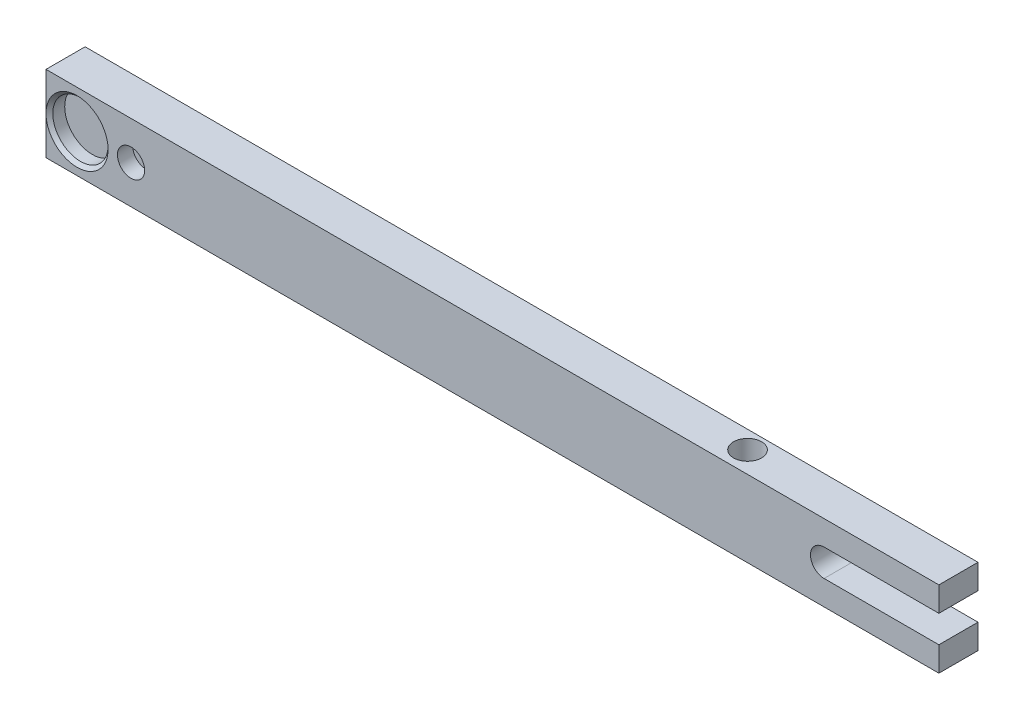
ISO-10303-21;
HEADER;
FILE_DESCRIPTION(('STEP AP214'),'2;1');
FILE_NAME('part.step','',(''),(''),'','','');
FILE_SCHEMA(('AUTOMOTIVE_DESIGN { 1 0 10303 214 1 1 1 1 }'));
ENDSEC;
DATA;
#1=APPLICATION_CONTEXT('core data for automotive mechanical design processes');
#2=APPLICATION_PROTOCOL_DEFINITION('international standard','automotive_design',2000,#1);
#3=PRODUCT_CONTEXT('',#1,'mechanical');
#4=PRODUCT('Part','Part','',(#3));
#5=PRODUCT_RELATED_PRODUCT_CATEGORY('part','',(#4));
#6=PRODUCT_DEFINITION_FORMATION('','',#4);
#7=PRODUCT_DEFINITION_CONTEXT('part definition',#1,'design');
#8=PRODUCT_DEFINITION('design','',#6,#7);
#9=PRODUCT_DEFINITION_SHAPE('','',#8);
#10=(LENGTH_UNIT() NAMED_UNIT(*) SI_UNIT(.MILLI.,.METRE.));
#11=(NAMED_UNIT(*) PLANE_ANGLE_UNIT() SI_UNIT($,.RADIAN.));
#12=(NAMED_UNIT(*) SI_UNIT($,.STERADIAN.) SOLID_ANGLE_UNIT());
#13=UNCERTAINTY_MEASURE_WITH_UNIT(LENGTH_MEASURE(1.E-05),#10,'distance_accuracy_value','');
#14=(GEOMETRIC_REPRESENTATION_CONTEXT(3) GLOBAL_UNCERTAINTY_ASSIGNED_CONTEXT((#13)) GLOBAL_UNIT_ASSIGNED_CONTEXT((#10,
#11,#12)) REPRESENTATION_CONTEXT('',''));
#15=CARTESIAN_POINT('',(0.,0.,0.));
#16=DIRECTION('',(0.,0.,1.));
#17=DIRECTION('',(1.,0.,0.));
#18=AXIS2_PLACEMENT_3D('',#15,#16,#17);
#19=CARTESIAN_POINT('',(52.5,-4.49999999999999,5.));
#20=DIRECTION('',(-1.,0.,0.));
#21=DIRECTION('',(0.,0.,1.));
#22=AXIS2_PLACEMENT_3D('',#19,#20,#21);
#23=PLANE('',#22);
#24=DIRECTION('',(0.,0.,1.));
#25=VECTOR('',#24,1.);
#26=CARTESIAN_POINT('',(52.5,1.6,-5.));
#27=LINE('',#26,#25);
#28=CARTESIAN_POINT('',(52.5,1.6,0.399999999999998));
#29=VERTEX_POINT('',#28);
#30=CARTESIAN_POINT('',(52.5,1.6,5.));
#31=VERTEX_POINT('',#30);
#32=EDGE_CURVE('E144',#29,#31,#27,.T.);
#33=ORIENTED_EDGE('',*,*,#32,.F.);
#34=DIRECTION('',(0.,1.,0.));
#35=VECTOR('',#34,1.);
#36=CARTESIAN_POINT('',(52.5,-4.49999999999999,0.399999999999998));
#37=LINE('',#36,#35);
#38=CARTESIAN_POINT('',(52.5,4.50000000000001,0.399999999999998));
#39=VERTEX_POINT('',#38);
#40=EDGE_CURVE('E11',#29,#39,#37,.T.);
#41=ORIENTED_EDGE('',*,*,#40,.T.);
#42=DIRECTION('',(0.,0.,-1.));
#43=VECTOR('',#42,1.);
#44=CARTESIAN_POINT('',(52.5,4.50000000000001,5.));
#45=LINE('',#44,#43);
#46=CARTESIAN_POINT('',(52.5,4.50000000000001,5.));
#47=VERTEX_POINT('',#46);
#48=EDGE_CURVE('E177',#47,#39,#45,.T.);
#49=ORIENTED_EDGE('',*,*,#48,.F.);
#50=DIRECTION('',(0.,1.,0.));
#51=VECTOR('',#50,1.);
#52=CARTESIAN_POINT('',(52.5,-4.49999999999999,5.));
#53=LINE('',#52,#51);
#54=EDGE_CURVE('E165',#31,#47,#53,.T.);
#55=ORIENTED_EDGE('',*,*,#54,.F.);
#56=EDGE_LOOP('',(#33,#41,#49,#55));
#57=FACE_BOUND('',#56,.T.);
#58=ADVANCED_FACE('F39',(#57),#23,.F.);
#59=CARTESIAN_POINT('',(-52.5,-4.50000000000001,5.));
#60=DIRECTION('',(1.,0.,0.));
#61=DIRECTION('',(0.,0.,-1.));
#62=AXIS2_PLACEMENT_3D('',#59,#60,#61);
#63=PLANE('',#62);
#64=DIRECTION('',(0.,0.,-1.));
#65=VECTOR('',#64,1.);
#66=CARTESIAN_POINT('',(-52.5,4.49999999999999,5.));
#67=LINE('',#66,#65);
#68=CARTESIAN_POINT('',(-52.5,4.49999999999999,5.));
#69=VERTEX_POINT('',#68);
#70=CARTESIAN_POINT('',(-52.5,4.49999999999999,0.399999999999998));
#71=VERTEX_POINT('',#70);
#72=EDGE_CURVE('E169',#69,#71,#67,.T.);
#73=ORIENTED_EDGE('',*,*,#72,.T.);
#74=DIRECTION('',(0.,-1.,0.));
#75=VECTOR('',#74,1.);
#76=CARTESIAN_POINT('',(-52.5,-4.50000000000001,0.399999999999998));
#77=LINE('',#76,#75);
#78=CARTESIAN_POINT('',(-52.5,-4.50000000000001,0.399999999999998));
#79=VERTEX_POINT('',#78);
#80=EDGE_CURVE('E225',#71,#79,#77,.T.);
#81=ORIENTED_EDGE('',*,*,#80,.T.);
#82=DIRECTION('',(0.,0.,-1.));
#83=VECTOR('',#82,1.);
#84=CARTESIAN_POINT('',(-52.5,-4.50000000000001,5.));
#85=LINE('',#84,#83);
#86=CARTESIAN_POINT('',(-52.5,-4.50000000000001,5.));
#87=VERTEX_POINT('',#86);
#88=EDGE_CURVE('E184',#87,#79,#85,.T.);
#89=ORIENTED_EDGE('',*,*,#88,.F.);
#90=DIRECTION('',(0.,-1.,0.));
#91=VECTOR('',#90,1.);
#92=CARTESIAN_POINT('',(-52.5,-4.50000000000001,5.));
#93=LINE('',#92,#91);
#94=CARTESIAN_POINT('',(-52.5,0.,5.));
#95=VERTEX_POINT('',#94);
#96=EDGE_CURVE('E294',#95,#87,#93,.T.);
#97=ORIENTED_EDGE('',*,*,#96,.F.);
#98=EDGE_CURVE('E296',#69,#95,#93,.T.);
#99=ORIENTED_EDGE('',*,*,#98,.F.);
#100=EDGE_LOOP('',(#73,#81,#89,#97,#99));
#101=FACE_BOUND('',#100,.T.);
#102=ADVANCED_FACE('F307',(#101),#63,.F.);
#103=CARTESIAN_POINT('',(52.5,-4.49999999999999,5.));
#104=DIRECTION('',(0.,1.,0.));
#105=DIRECTION('',(-1.,0.,0.));
#106=AXIS2_PLACEMENT_3D('',#103,#104,#105);
#107=PLANE('',#106);
#108=CARTESIAN_POINT('',(27.5,-4.5,2.5));
#109=DIRECTION('',(0.,1.,0.));
#110=DIRECTION('',(-1.,0.,0.));
#111=AXIS2_PLACEMENT_3D('',#108,#109,#110);
#112=CIRCLE('',#111,1.65);
#113=CARTESIAN_POINT('',(25.85,-4.5,2.5));
#114=VERTEX_POINT('',#113);
#115=EDGE_CURVE('E244',#114,#114,#112,.T.);
#116=ORIENTED_EDGE('',*,*,#115,.T.);
#117=EDGE_LOOP('',(#116));
#118=FACE_BOUND('',#117,.T.);
#119=ORIENTED_EDGE('',*,*,#88,.T.);
#120=DIRECTION('',(1.,0.,0.));
#121=VECTOR('',#120,1.);
#122=CARTESIAN_POINT('',(52.5,-4.49999999999999,0.399999999999998));
#123=LINE('',#122,#121);
#124=CARTESIAN_POINT('',(52.5,-4.49999999999999,0.399999999999998));
#125=VERTEX_POINT('',#124);
#126=EDGE_CURVE('E228',#79,#125,#123,.T.);
#127=ORIENTED_EDGE('',*,*,#126,.T.);
#128=DIRECTION('',(0.,0.,-1.));
#129=VECTOR('',#128,1.);
#130=CARTESIAN_POINT('',(52.5,-4.49999999999999,5.));
#131=LINE('',#130,#129);
#132=CARTESIAN_POINT('',(52.5,-4.49999999999999,5.));
#133=VERTEX_POINT('',#132);
#134=EDGE_CURVE('E181',#133,#125,#131,.T.);
#135=ORIENTED_EDGE('',*,*,#134,.F.);
#136=DIRECTION('',(1.,0.,0.));
#137=VECTOR('',#136,1.);
#138=CARTESIAN_POINT('',(52.5,-4.49999999999999,5.));
#139=LINE('',#138,#137);
#140=EDGE_CURVE('E161',#87,#133,#139,.T.);
#141=ORIENTED_EDGE('',*,*,#140,.F.);
#142=EDGE_LOOP('',(#119,#127,#135,#141));
#143=FACE_BOUND('',#142,.T.);
#144=ADVANCED_FACE('F305',(#118,#143),#107,.F.);
#145=ORIENTED_EDGE('',*,*,#134,.T.);
#146=DIRECTION('',(0.,1.,0.));
#147=VECTOR('',#146,1.);
#148=CARTESIAN_POINT('',(52.5,-4.49999999999999,0.399999999999998));
#149=LINE('',#148,#147);
#150=CARTESIAN_POINT('',(52.5,-1.6,0.399999999999998));
#151=VERTEX_POINT('',#150);
#152=EDGE_CURVE('E140',#125,#151,#149,.T.);
#153=ORIENTED_EDGE('',*,*,#152,.T.);
#154=DIRECTION('',(0.,0.,1.));
#155=VECTOR('',#154,1.);
#156=CARTESIAN_POINT('',(52.5,-1.6,-5.));
#157=LINE('',#156,#155);
#158=CARTESIAN_POINT('',(52.5,-1.6,5.));
#159=VERTEX_POINT('',#158);
#160=EDGE_CURVE('E133',#151,#159,#157,.T.);
#161=ORIENTED_EDGE('',*,*,#160,.T.);
#162=EDGE_CURVE('E138',#133,#159,#53,.T.);
#163=ORIENTED_EDGE('',*,*,#162,.F.);
#164=EDGE_LOOP('',(#145,#153,#161,#163));
#165=FACE_BOUND('',#164,.T.);
#166=ADVANCED_FACE('F136',(#165),#23,.F.);
#167=CARTESIAN_POINT('',(52.5,4.50000000000001,5.));
#168=DIRECTION('',(0.,-1.,0.));
#169=DIRECTION('',(1.,0.,0.));
#170=AXIS2_PLACEMENT_3D('',#167,#168,#169);
#171=PLANE('',#170);
#172=CARTESIAN_POINT('',(27.5,4.5,2.5));
#173=DIRECTION('',(0.,1.,0.));
#174=DIRECTION('',(-1.,0.,0.));
#175=AXIS2_PLACEMENT_3D('',#172,#173,#174);
#176=CIRCLE('',#175,1.65);
#177=CARTESIAN_POINT('',(25.85,4.5,2.5));
#178=VERTEX_POINT('',#177);
#179=EDGE_CURVE('E592',#178,#178,#176,.T.);
#180=ORIENTED_EDGE('',*,*,#179,.F.);
#181=EDGE_LOOP('',(#180));
#182=FACE_BOUND('',#181,.T.);
#183=ORIENTED_EDGE('',*,*,#48,.T.);
#184=DIRECTION('',(-1.,0.,0.));
#185=VECTOR('',#184,1.);
#186=CARTESIAN_POINT('',(52.5,4.50000000000001,0.399999999999998));
#187=LINE('',#186,#185);
#188=EDGE_CURVE('E196',#39,#71,#187,.T.);
#189=ORIENTED_EDGE('',*,*,#188,.T.);
#190=ORIENTED_EDGE('',*,*,#72,.F.);
#191=DIRECTION('',(-1.,0.,0.));
#192=VECTOR('',#191,1.);
#193=CARTESIAN_POINT('',(52.5,4.50000000000001,5.));
#194=LINE('',#193,#192);
#195=EDGE_CURVE('E164',#47,#69,#194,.T.);
#196=ORIENTED_EDGE('',*,*,#195,.F.);
#197=EDGE_LOOP('',(#183,#189,#190,#196));
#198=FACE_BOUND('',#197,.T.);
#199=ADVANCED_FACE('F317',(#182,#198),#171,.F.);
#200=CARTESIAN_POINT('',(0.,0.,5.));
#201=DIRECTION('',(0.,0.,1.));
#202=DIRECTION('',(1.,0.,0.));
#203=AXIS2_PLACEMENT_3D('',#200,#201,#202);
#204=PLANE('',#203);
#205=CARTESIAN_POINT('',(-42.5,0.,5.));
#206=DIRECTION('',(0.,0.,-1.));
#207=DIRECTION('',(-1.,0.,0.));
#208=AXIS2_PLACEMENT_3D('',#205,#206,#207);
#209=CIRCLE('',#208,1.6);
#210=CARTESIAN_POINT('',(-44.1,0.,5.));
#211=VERTEX_POINT('',#210);
#212=EDGE_CURVE('E269',#211,#211,#209,.T.);
#213=ORIENTED_EDGE('',*,*,#212,.T.);
#214=EDGE_LOOP('',(#213));
#215=FACE_BOUND('',#214,.T.);
#216=ORIENTED_EDGE('',*,*,#98,.T.);
#217=CARTESIAN_POINT('',(-48.85,0.,5.));
#218=DIRECTION('',(0.,0.,1.));
#219=DIRECTION('',(1.,0.,0.));
#220=AXIS2_PLACEMENT_3D('',#217,#218,#219);
#221=CIRCLE('',#220,3.65);
#222=EDGE_CURVE('E188',#95,#95,#221,.F.);
#223=ORIENTED_EDGE('',*,*,#222,.T.);
#224=ORIENTED_EDGE('',*,*,#96,.T.);
#225=ORIENTED_EDGE('',*,*,#140,.T.);
#226=ORIENTED_EDGE('',*,*,#162,.T.);
#227=DIRECTION('',(1.,0.,0.));
#228=VECTOR('',#227,1.);
#229=CARTESIAN_POINT('',(39.,-1.6,5.));
#230=LINE('',#229,#228);
#231=CARTESIAN_POINT('',(39.,-1.6,5.));
#232=VERTEX_POINT('',#231);
#233=EDGE_CURVE('E148',#232,#159,#230,.T.);
#234=ORIENTED_EDGE('',*,*,#233,.F.);
#235=CARTESIAN_POINT('',(39.,0.,5.));
#236=DIRECTION('',(0.,0.,1.));
#237=DIRECTION('',(1.,0.,0.));
#238=AXIS2_PLACEMENT_3D('',#235,#236,#237);
#239=CIRCLE('',#238,1.6);
#240=CARTESIAN_POINT('',(39.,1.6,5.));
#241=VERTEX_POINT('',#240);
#242=EDGE_CURVE('E156',#241,#232,#239,.T.);
#243=ORIENTED_EDGE('',*,*,#242,.F.);
#244=DIRECTION('',(-1.,0.,0.));
#245=VECTOR('',#244,1.);
#246=CARTESIAN_POINT('',(39.,1.6,5.));
#247=LINE('',#246,#245);
#248=EDGE_CURVE('E155',#31,#241,#247,.T.);
#249=ORIENTED_EDGE('',*,*,#248,.F.);
#250=ORIENTED_EDGE('',*,*,#54,.T.);
#251=ORIENTED_EDGE('',*,*,#195,.T.);
#252=EDGE_LOOP('',(#216,#223,#224,#225,#226,#234,#243,#249,#250,#251));
#253=FACE_BOUND('',#252,.T.);
#254=ADVANCED_FACE('F159',(#215,#253),#204,.T.);
#255=CARTESIAN_POINT('',(0.,0.,0.));
#256=DIRECTION('',(0.,0.,1.));
#257=DIRECTION('',(1.,0.,0.));
#258=AXIS2_PLACEMENT_3D('',#255,#256,#257);
#259=PLANE('',#258);
#260=CARTESIAN_POINT('',(-2.49999999999998,0.,0.));
#261=DIRECTION('',(0.,0.,1.));
#262=DIRECTION('',(1.,0.,0.));
#263=AXIS2_PLACEMENT_3D('',#260,#261,#262);
#264=CIRCLE('',#263,1.5);
#265=CARTESIAN_POINT('',(-0.999999999999981,0.,0.));
#266=VERTEX_POINT('',#265);
#267=EDGE_CURVE('E43',#266,#266,#264,.T.);
#268=ORIENTED_EDGE('',*,*,#267,.T.);
#269=EDGE_LOOP('',(#268));
#270=FACE_BOUND('',#269,.T.);
#271=DIRECTION('',(0.,1.,0.));
#272=VECTOR('',#271,1.);
#273=CARTESIAN_POINT('',(-52.1,0.,0.));
#274=LINE('',#273,#272);
#275=CARTESIAN_POINT('',(-52.1,-4.10000000000001,0.));
#276=VERTEX_POINT('',#275);
#277=CARTESIAN_POINT('',(-52.1,4.1,0.));
#278=VERTEX_POINT('',#277);
#279=EDGE_CURVE('E218',#276,#278,#274,.T.);
#280=ORIENTED_EDGE('',*,*,#279,.T.);
#281=DIRECTION('',(1.,0.,0.));
#282=VECTOR('',#281,1.);
#283=CARTESIAN_POINT('',(0.,4.1,0.));
#284=LINE('',#283,#282);
#285=CARTESIAN_POINT('',(52.1,4.10000000000001,0.));
#286=VERTEX_POINT('',#285);
#287=EDGE_CURVE('E221',#278,#286,#284,.T.);
#288=ORIENTED_EDGE('',*,*,#287,.T.);
#289=DIRECTION('',(0.,-1.,0.));
#290=VECTOR('',#289,1.);
#291=CARTESIAN_POINT('',(52.1,0.,0.));
#292=LINE('',#291,#290);
#293=CARTESIAN_POINT('',(52.1,2.,0.));
#294=VERTEX_POINT('',#293);
#295=EDGE_CURVE('E200',#286,#294,#292,.T.);
#296=ORIENTED_EDGE('',*,*,#295,.T.);
#297=DIRECTION('',(-1.,0.,0.));
#298=VECTOR('',#297,1.);
#299=CARTESIAN_POINT('',(0.,1.99999999999999,0.));
#300=LINE('',#299,#298);
#301=CARTESIAN_POINT('',(39.,2.,0.));
#302=VERTEX_POINT('',#301);
#303=EDGE_CURVE('E203',#294,#302,#300,.T.);
#304=ORIENTED_EDGE('',*,*,#303,.T.);
#305=CARTESIAN_POINT('',(39.,0.,0.));
#306=DIRECTION('',(0.,0.,1.));
#307=DIRECTION('',(1.,0.,0.));
#308=AXIS2_PLACEMENT_3D('',#305,#306,#307);
#309=CIRCLE('',#308,2.);
#310=CARTESIAN_POINT('',(39.,-2.,0.));
#311=VERTEX_POINT('',#310);
#312=EDGE_CURVE('E206',#302,#311,#309,.T.);
#313=ORIENTED_EDGE('',*,*,#312,.T.);
#314=DIRECTION('',(1.,0.,0.));
#315=VECTOR('',#314,1.);
#316=CARTESIAN_POINT('',(0.,-2.00000000000001,0.));
#317=LINE('',#316,#315);
#318=CARTESIAN_POINT('',(52.1,-2.,0.));
#319=VERTEX_POINT('',#318);
#320=EDGE_CURVE('E209',#311,#319,#317,.T.);
#321=ORIENTED_EDGE('',*,*,#320,.T.);
#322=DIRECTION('',(0.,-1.,0.));
#323=VECTOR('',#322,1.);
#324=CARTESIAN_POINT('',(52.1,0.,0.));
#325=LINE('',#324,#323);
#326=CARTESIAN_POINT('',(52.1,-4.1,0.));
#327=VERTEX_POINT('',#326);
#328=EDGE_CURVE('E212',#319,#327,#325,.T.);
#329=ORIENTED_EDGE('',*,*,#328,.T.);
#330=DIRECTION('',(-1.,0.,0.));
#331=VECTOR('',#330,1.);
#332=CARTESIAN_POINT('',(0.,-4.1,0.));
#333=LINE('',#332,#331);
#334=EDGE_CURVE('E215',#327,#276,#333,.T.);
#335=ORIENTED_EDGE('',*,*,#334,.T.);
#336=EDGE_LOOP('',(#280,#288,#296,#304,#313,#321,#329,#335));
#337=FACE_BOUND('',#336,.T.);
#338=ADVANCED_FACE('F326',(#270,#337),#259,.F.);
#339=CARTESIAN_POINT('',(39.,0.,0.));
#340=DIRECTION('',(0.,0.,1.));
#341=DIRECTION('',(1.,0.,0.));
#342=AXIS2_PLACEMENT_3D('',#339,#340,#341);
#343=CYLINDRICAL_SURFACE('',#342,1.6);
#344=DIRECTION('',(0.,0.,1.));
#345=VECTOR('',#344,1.);
#346=CARTESIAN_POINT('',(39.,-1.6,0.));
#347=LINE('',#346,#345);
#348=CARTESIAN_POINT('',(39.,-1.6,0.399999999999998));
#349=VERTEX_POINT('',#348);
#350=EDGE_CURVE('E150',#349,#232,#347,.T.);
#351=ORIENTED_EDGE('',*,*,#350,.F.);
#352=CARTESIAN_POINT('',(39.,0.,0.399999999999998));
#353=DIRECTION('',(0.,0.,1.));
#354=DIRECTION('',(1.,0.,0.));
#355=AXIS2_PLACEMENT_3D('',#352,#353,#354);
#356=CIRCLE('',#355,1.6);
#357=CARTESIAN_POINT('',(39.,1.6,0.399999999999998));
#358=VERTEX_POINT('',#357);
#359=EDGE_CURVE('E64',#349,#358,#356,.F.);
#360=ORIENTED_EDGE('',*,*,#359,.T.);
#361=DIRECTION('',(0.,0.,1.));
#362=VECTOR('',#361,1.);
#363=CARTESIAN_POINT('',(39.,1.6,0.));
#364=LINE('',#363,#362);
#365=EDGE_CURVE('E291',#358,#241,#364,.T.);
#366=ORIENTED_EDGE('',*,*,#365,.T.);
#367=ORIENTED_EDGE('',*,*,#242,.T.);
#368=EDGE_LOOP('',(#351,#360,#366,#367));
#369=FACE_BOUND('',#368,.T.);
#370=ADVANCED_FACE('F338',(#369),#343,.F.);
#371=CARTESIAN_POINT('',(39.,1.6,0.));
#372=DIRECTION('',(0.,1.,0.));
#373=DIRECTION('',(-1.,0.,0.));
#374=AXIS2_PLACEMENT_3D('',#371,#372,#373);
#375=PLANE('',#374);
#376=ORIENTED_EDGE('',*,*,#365,.F.);
#377=DIRECTION('',(1.,0.,0.));
#378=VECTOR('',#377,1.);
#379=CARTESIAN_POINT('',(39.,1.6,0.399999999999998));
#380=LINE('',#379,#378);
#381=EDGE_CURVE('E49',#358,#29,#380,.T.);
#382=ORIENTED_EDGE('',*,*,#381,.T.);
#383=ORIENTED_EDGE('',*,*,#32,.T.);
#384=ORIENTED_EDGE('',*,*,#248,.T.);
#385=EDGE_LOOP('',(#376,#382,#383,#384));
#386=FACE_BOUND('',#385,.T.);
#387=ADVANCED_FACE('F520',(#386),#375,.F.);
#388=CARTESIAN_POINT('',(39.,-1.6,0.));
#389=DIRECTION('',(0.,-1.,0.));
#390=DIRECTION('',(1.,0.,0.));
#391=AXIS2_PLACEMENT_3D('',#388,#389,#390);
#392=PLANE('',#391);
#393=ORIENTED_EDGE('',*,*,#160,.F.);
#394=DIRECTION('',(-1.,0.,0.));
#395=VECTOR('',#394,1.);
#396=CARTESIAN_POINT('',(39.,-1.6,0.399999999999998));
#397=LINE('',#396,#395);
#398=EDGE_CURVE('E233',#151,#349,#397,.T.);
#399=ORIENTED_EDGE('',*,*,#398,.T.);
#400=ORIENTED_EDGE('',*,*,#350,.T.);
#401=ORIENTED_EDGE('',*,*,#233,.T.);
#402=EDGE_LOOP('',(#393,#399,#400,#401));
#403=FACE_BOUND('',#402,.T.);
#404=ADVANCED_FACE('F149',(#403),#392,.F.);
#405=CARTESIAN_POINT('',(-42.5,0.,3.2));
#406=DIRECTION('',(0.,0.,1.));
#407=DIRECTION('',(1.,0.,0.));
#408=AXIS2_PLACEMENT_3D('',#405,#406,#407);
#409=CYLINDRICAL_SURFACE('',#408,1.6);
#410=CARTESIAN_POINT('',(-42.5,0.,3.2));
#411=DIRECTION('',(0.,0.,-1.));
#412=DIRECTION('',(-1.,0.,0.));
#413=AXIS2_PLACEMENT_3D('',#410,#411,#412);
#414=CIRCLE('',#413,1.6);
#415=CARTESIAN_POINT('',(-44.1,0.,3.2));
#416=VERTEX_POINT('',#415);
#417=EDGE_CURVE('E275',#416,#416,#414,.T.);
#418=ORIENTED_EDGE('',*,*,#417,.T.);
#419=EDGE_LOOP('',(#418));
#420=FACE_BOUND('',#419,.T.);
#421=ORIENTED_EDGE('',*,*,#212,.F.);
#422=EDGE_LOOP('',(#421));
#423=FACE_BOUND('',#422,.T.);
#424=ADVANCED_FACE('F503',(#420,#423),#409,.F.);
#425=CARTESIAN_POINT('',(-42.5,0.,3.2));
#426=DIRECTION('',(0.,0.,-1.));
#427=DIRECTION('',(-1.,0.,0.));
#428=AXIS2_PLACEMENT_3D('',#425,#426,#427);
#429=PLANE('',#428);
#430=ORIENTED_EDGE('',*,*,#417,.F.);
#431=EDGE_LOOP('',(#430));
#432=FACE_BOUND('',#431,.T.);
#433=ADVANCED_FACE('F495',(#432),#429,.F.);
#434=CARTESIAN_POINT('',(-48.85,0.,3.2));
#435=DIRECTION('',(0.,0.,1.));
#436=DIRECTION('',(1.,0.,0.));
#437=AXIS2_PLACEMENT_3D('',#434,#435,#436);
#438=CYLINDRICAL_SURFACE('',#437,3.25);
#439=CARTESIAN_POINT('',(-48.85,0.,4.6));
#440=DIRECTION('',(0.,0.,1.));
#441=DIRECTION('',(1.,0.,0.));
#442=AXIS2_PLACEMENT_3D('',#439,#440,#441);
#443=CIRCLE('',#442,3.25);
#444=CARTESIAN_POINT('',(-45.6,0.,4.6));
#445=VERTEX_POINT('',#444);
#446=EDGE_CURVE('E192',#445,#445,#443,.T.);
#447=ORIENTED_EDGE('',*,*,#446,.T.);
#448=EDGE_LOOP('',(#447));
#449=FACE_BOUND('',#448,.T.);
#450=CARTESIAN_POINT('',(-48.85,0.,3.2));
#451=DIRECTION('',(0.,0.,-1.));
#452=DIRECTION('',(-1.,0.,0.));
#453=AXIS2_PLACEMENT_3D('',#450,#451,#452);
#454=CIRCLE('',#453,3.25);
#455=CARTESIAN_POINT('',(-52.1,0.,3.2));
#456=VERTEX_POINT('',#455);
#457=EDGE_CURVE('E145',#456,#456,#454,.T.);
#458=ORIENTED_EDGE('',*,*,#457,.T.);
#459=EDGE_LOOP('',(#458));
#460=FACE_BOUND('',#459,.T.);
#461=ADVANCED_FACE('F485',(#449,#460),#438,.F.);
#462=CARTESIAN_POINT('',(-48.85,0.,3.2));
#463=DIRECTION('',(0.,0.,-1.));
#464=DIRECTION('',(-1.,0.,0.));
#465=AXIS2_PLACEMENT_3D('',#462,#463,#464);
#466=PLANE('',#465);
#467=ORIENTED_EDGE('',*,*,#457,.F.);
#468=EDGE_LOOP('',(#467));
#469=FACE_BOUND('',#468,.T.);
#470=ADVANCED_FACE('F378',(#469),#466,.F.);
#471=CARTESIAN_POINT('',(-48.85,0.,5.));
#472=DIRECTION('',(0.,0.,1.));
#473=DIRECTION('',(1.,0.,0.));
#474=AXIS2_PLACEMENT_3D('',#471,#472,#473);
#475=CONICAL_SURFACE('',#474,3.65,0.785398163397451);
#476=ORIENTED_EDGE('',*,*,#446,.F.);
#477=EDGE_LOOP('',(#476));
#478=FACE_BOUND('',#477,.T.);
#479=ORIENTED_EDGE('',*,*,#222,.F.);
#480=EDGE_LOOP('',(#479));
#481=FACE_BOUND('',#480,.T.);
#482=ADVANCED_FACE('F356',(#478,#481),#475,.F.);
#483=CARTESIAN_POINT('',(0.,-2.00000000000001,0.));
#484=DIRECTION('',(0.,-0.707106781186547,0.707106781186548));
#485=DIRECTION('',(1.,0.,0.));
#486=AXIS2_PLACEMENT_3D('',#483,#484,#485);
#487=PLANE('',#486);
#488=DIRECTION('',(-0.577350269189626,-0.577350269189626,-0.577350269189626));
#489=VECTOR('',#488,1.);
#490=CARTESIAN_POINT('',(34.7333333333333,-19.3666666666667,-17.3666666666667));
#491=LINE('',#490,#489);
#492=EDGE_CURVE('E263',#319,#151,#491,.F.);
#493=ORIENTED_EDGE('',*,*,#492,.F.);
#494=ORIENTED_EDGE('',*,*,#320,.F.);
#495=DIRECTION('',(0.,-0.707106781186548,-0.707106781186547));
#496=VECTOR('',#495,1.);
#497=CARTESIAN_POINT('',(39.,-1.6,0.399999999999998));
#498=LINE('',#497,#496);
#499=EDGE_CURVE('E266',#349,#311,#498,.T.);
#500=ORIENTED_EDGE('',*,*,#499,.F.);
#501=ORIENTED_EDGE('',*,*,#398,.F.);
#502=EDGE_LOOP('',(#493,#494,#500,#501));
#503=FACE_BOUND('',#502,.T.);
#504=ADVANCED_FACE('F41',(#503),#487,.F.);
#505=CARTESIAN_POINT('',(39.,0.,0.));
#506=DIRECTION('',(0.,0.,-1.));
#507=DIRECTION('',(-1.,0.,0.));
#508=AXIS2_PLACEMENT_3D('',#505,#506,#507);
#509=CONICAL_SURFACE('',#508,2.,0.785398163397449);
#510=ORIENTED_EDGE('',*,*,#499,.T.);
#511=ORIENTED_EDGE('',*,*,#312,.F.);
#512=DIRECTION('',(0.,0.707106781186548,-0.707106781186547));
#513=VECTOR('',#512,1.);
#514=CARTESIAN_POINT('',(39.,1.6,0.399999999999998));
#515=LINE('',#514,#513);
#516=EDGE_CURVE('E259',#358,#302,#515,.T.);
#517=ORIENTED_EDGE('',*,*,#516,.F.);
#518=ORIENTED_EDGE('',*,*,#359,.F.);
#519=EDGE_LOOP('',(#510,#511,#517,#518));
#520=FACE_BOUND('',#519,.T.);
#521=ADVANCED_FACE('F349',(#520),#509,.F.);
#522=CARTESIAN_POINT('',(52.5,-4.49999999999999,0.399999999999998));
#523=DIRECTION('',(-0.707106781186548,0.,0.707106781186548));
#524=DIRECTION('',(0.,1.,0.));
#525=AXIS2_PLACEMENT_3D('',#522,#523,#524);
#526=PLANE('',#525);
#527=ORIENTED_EDGE('',*,*,#492,.T.);
#528=ORIENTED_EDGE('',*,*,#152,.F.);
#529=DIRECTION('',(-0.577350269189626,0.577350269189626,-0.577350269189626));
#530=VECTOR('',#529,1.);
#531=CARTESIAN_POINT('',(52.5,-4.49999999999999,0.399999999999998));
#532=LINE('',#531,#530);
#533=EDGE_CURVE('E255',#327,#125,#532,.F.);
#534=ORIENTED_EDGE('',*,*,#533,.F.);
#535=ORIENTED_EDGE('',*,*,#328,.F.);
#536=EDGE_LOOP('',(#527,#528,#534,#535));
#537=FACE_BOUND('',#536,.T.);
#538=ADVANCED_FACE('F334',(#537),#526,.F.);
#539=CARTESIAN_POINT('',(0.,1.99999999999999,0.));
#540=DIRECTION('',(0.,0.707106781186547,0.707106781186548));
#541=DIRECTION('',(-1.,0.,0.));
#542=AXIS2_PLACEMENT_3D('',#539,#540,#541);
#543=PLANE('',#542);
#544=ORIENTED_EDGE('',*,*,#516,.T.);
#545=ORIENTED_EDGE('',*,*,#303,.F.);
#546=DIRECTION('',(-0.577350269189626,0.577350269189626,-0.577350269189626));
#547=VECTOR('',#546,1.);
#548=CARTESIAN_POINT('',(54.5333333333333,-0.433333333333329,2.43333333333333));
#549=LINE('',#548,#547);
#550=EDGE_CURVE('E251',#29,#294,#549,.T.);
#551=ORIENTED_EDGE('',*,*,#550,.F.);
#552=ORIENTED_EDGE('',*,*,#381,.F.);
#553=EDGE_LOOP('',(#544,#545,#551,#552));
#554=FACE_BOUND('',#553,.T.);
#555=ADVANCED_FACE('F347',(#554),#543,.F.);
#556=CARTESIAN_POINT('',(52.5,-4.49999999999999,0.399999999999998));
#557=DIRECTION('',(0.,0.707106781186547,0.707106781186548));
#558=DIRECTION('',(1.,0.,0.));
#559=AXIS2_PLACEMENT_3D('',#556,#557,#558);
#560=PLANE('',#559);
#561=ORIENTED_EDGE('',*,*,#533,.T.);
#562=ORIENTED_EDGE('',*,*,#126,.F.);
#563=DIRECTION('',(0.577350269189626,0.577350269189626,-0.577350269189626));
#564=VECTOR('',#563,1.);
#565=CARTESIAN_POINT('',(-17.5,30.5,-34.6));
#566=LINE('',#565,#564);
#567=EDGE_CURVE('E247',#276,#79,#566,.F.);
#568=ORIENTED_EDGE('',*,*,#567,.F.);
#569=ORIENTED_EDGE('',*,*,#334,.F.);
#570=EDGE_LOOP('',(#561,#562,#568,#569));
#571=FACE_BOUND('',#570,.T.);
#572=ADVANCED_FACE('F332',(#571),#560,.F.);
#573=CARTESIAN_POINT('',(52.5,-4.49999999999999,0.399999999999998));
#574=DIRECTION('',(-0.707106781186548,0.,0.707106781186548));
#575=DIRECTION('',(0.,1.,0.));
#576=AXIS2_PLACEMENT_3D('',#573,#574,#575);
#577=PLANE('',#576);
#578=ORIENTED_EDGE('',*,*,#550,.T.);
#579=ORIENTED_EDGE('',*,*,#295,.F.);
#580=DIRECTION('',(0.577350269189626,0.577350269189626,0.577350269189626));
#581=VECTOR('',#580,1.);
#582=CARTESIAN_POINT('',(49.5,1.50000000000001,-2.6));
#583=LINE('',#582,#581);
#584=EDGE_CURVE('E243',#39,#286,#583,.F.);
#585=ORIENTED_EDGE('',*,*,#584,.F.);
#586=ORIENTED_EDGE('',*,*,#40,.F.);
#587=EDGE_LOOP('',(#578,#579,#585,#586));
#588=FACE_BOUND('',#587,.T.);
#589=ADVANCED_FACE('F345',(#588),#577,.F.);
#590=CARTESIAN_POINT('',(-52.5,-4.50000000000001,0.399999999999998));
#591=DIRECTION('',(0.707106781186548,0.,0.707106781186548));
#592=DIRECTION('',(0.,-1.,0.));
#593=AXIS2_PLACEMENT_3D('',#590,#591,#592);
#594=PLANE('',#593);
#595=ORIENTED_EDGE('',*,*,#567,.T.);
#596=ORIENTED_EDGE('',*,*,#80,.F.);
#597=DIRECTION('',(0.577350269189626,-0.577350269189625,-0.577350269189626));
#598=VECTOR('',#597,1.);
#599=CARTESIAN_POINT('',(-49.5,1.5,-2.6));
#600=LINE('',#599,#598);
#601=EDGE_CURVE('E240',#278,#71,#600,.F.);
#602=ORIENTED_EDGE('',*,*,#601,.F.);
#603=ORIENTED_EDGE('',*,*,#279,.F.);
#604=EDGE_LOOP('',(#595,#596,#602,#603));
#605=FACE_BOUND('',#604,.T.);
#606=ADVANCED_FACE('F312',(#605),#594,.F.);
#607=CARTESIAN_POINT('',(52.5,4.50000000000001,0.399999999999998));
#608=DIRECTION('',(0.,-0.707106781186548,0.707106781186547));
#609=DIRECTION('',(-1.,0.,0.));
#610=AXIS2_PLACEMENT_3D('',#607,#608,#609);
#611=PLANE('',#610);
#612=ORIENTED_EDGE('',*,*,#584,.T.);
#613=ORIENTED_EDGE('',*,*,#287,.F.);
#614=ORIENTED_EDGE('',*,*,#601,.T.);
#615=ORIENTED_EDGE('',*,*,#188,.F.);
#616=EDGE_LOOP('',(#612,#613,#614,#615));
#617=FACE_BOUND('',#616,.T.);
#618=ADVANCED_FACE('F322',(#617),#611,.F.);
#619=CARTESIAN_POINT('',(27.5,-5.5,2.5));
#620=DIRECTION('',(0.,1.,0.));
#621=DIRECTION('',(-1.,0.,0.));
#622=AXIS2_PLACEMENT_3D('',#619,#620,#621);
#623=CYLINDRICAL_SURFACE('',#622,1.65);
#624=ORIENTED_EDGE('',*,*,#179,.T.);
#625=EDGE_LOOP('',(#624));
#626=FACE_BOUND('',#625,.T.);
#627=ORIENTED_EDGE('',*,*,#115,.F.);
#628=EDGE_LOOP('',(#627));
#629=FACE_BOUND('',#628,.T.);
#630=ADVANCED_FACE('F382',(#626,#629),#623,.F.);
#631=CARTESIAN_POINT('',(-2.49999999999998,0.,-4.));
#632=DIRECTION('',(0.,0.,1.));
#633=DIRECTION('',(1.,0.,0.));
#634=AXIS2_PLACEMENT_3D('',#631,#632,#633);
#635=CYLINDRICAL_SURFACE('',#634,1.5);
#636=CARTESIAN_POINT('',(-2.49999999999998,0.,4.));
#637=DIRECTION('',(0.,0.,1.));
#638=DIRECTION('',(1.,0.,0.));
#639=AXIS2_PLACEMENT_3D('',#636,#637,#638);
#640=CIRCLE('',#639,1.5);
#641=CARTESIAN_POINT('',(-0.999999999999981,0.,4.));
#642=VERTEX_POINT('',#641);
#643=EDGE_CURVE('E593',#642,#642,#640,.T.);
#644=ORIENTED_EDGE('',*,*,#643,.T.);
#645=EDGE_LOOP('',(#644));
#646=FACE_BOUND('',#645,.T.);
#647=ORIENTED_EDGE('',*,*,#267,.F.);
#648=EDGE_LOOP('',(#647));
#649=FACE_BOUND('',#648,.T.);
#650=ADVANCED_FACE('F416',(#646,#649),#635,.F.);
#651=CARTESIAN_POINT('',(-2.49999999999998,0.,4.));
#652=DIRECTION('',(0.,0.,1.));
#653=DIRECTION('',(1.,0.,0.));
#654=AXIS2_PLACEMENT_3D('',#651,#652,#653);
#655=PLANE('',#654);
#656=ORIENTED_EDGE('',*,*,#643,.F.);
#657=EDGE_LOOP('',(#656));
#658=FACE_BOUND('',#657,.T.);
#659=ADVANCED_FACE('F426',(#658),#655,.F.);
#660=CLOSED_SHELL('',(#58,#102,#144,#166,#199,#254,#338,#370,#387,#404,#424,#433,#461,#470,#482,
#504,#521,#538,#555,#572,#589,#606,#618,#630,#650,#659));
#661=MANIFOLD_SOLID_BREP('B2',#660);
#662=ADVANCED_BREP_SHAPE_REPRESENTATION('',(#18,#661),#14);
#663=SHAPE_DEFINITION_REPRESENTATION(#9,#662);
ENDSEC;
END-ISO-10303-21;
